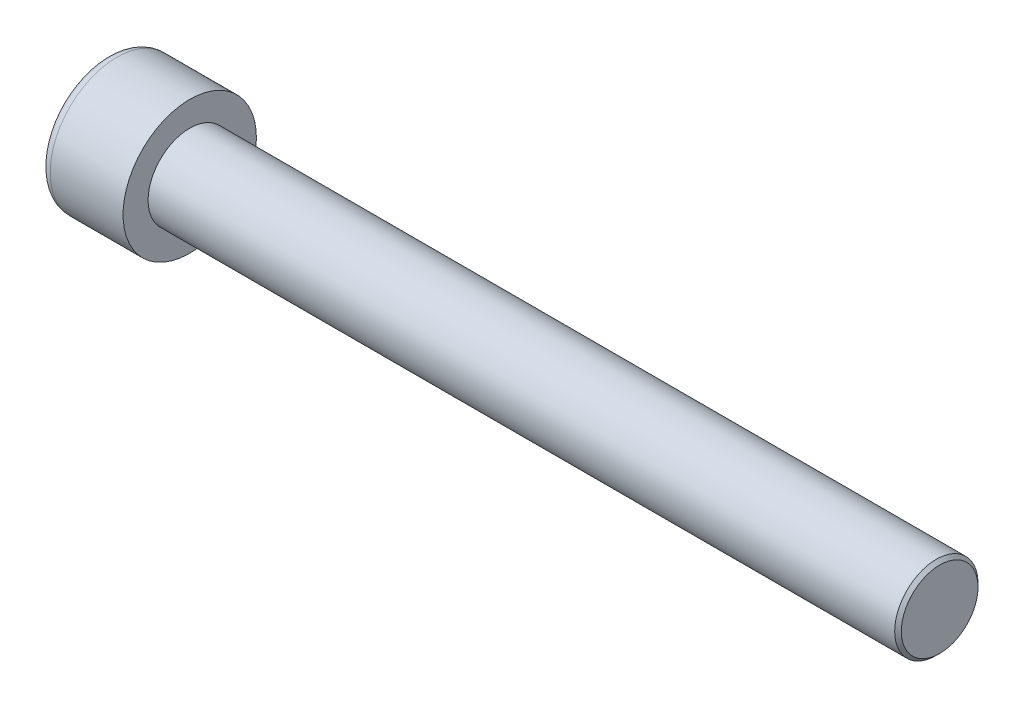
ISO-10303-21;
HEADER;
FILE_DESCRIPTION(('STEP AP214'),'2;1');
FILE_NAME('part.step','',(''),(''),'','','');
FILE_SCHEMA(('AUTOMOTIVE_DESIGN { 1 0 10303 214 1 1 1 1 }'));
ENDSEC;
DATA;
#1=APPLICATION_CONTEXT('core data for automotive mechanical design processes');
#2=APPLICATION_PROTOCOL_DEFINITION('international standard','automotive_design',2000,#1);
#3=PRODUCT_CONTEXT('',#1,'mechanical');
#4=PRODUCT('Part','Part','',(#3));
#5=PRODUCT_RELATED_PRODUCT_CATEGORY('part','',(#4));
#6=PRODUCT_DEFINITION_FORMATION('','',#4);
#7=PRODUCT_DEFINITION_CONTEXT('part definition',#1,'design');
#8=PRODUCT_DEFINITION('design','',#6,#7);
#9=PRODUCT_DEFINITION_SHAPE('','',#8);
#10=(LENGTH_UNIT() NAMED_UNIT(*) SI_UNIT(.MILLI.,.METRE.));
#11=(NAMED_UNIT(*) PLANE_ANGLE_UNIT() SI_UNIT($,.RADIAN.));
#12=(NAMED_UNIT(*) SI_UNIT($,.STERADIAN.) SOLID_ANGLE_UNIT());
#13=UNCERTAINTY_MEASURE_WITH_UNIT(LENGTH_MEASURE(1.E-05),#10,'distance_accuracy_value','');
#14=(GEOMETRIC_REPRESENTATION_CONTEXT(3) GLOBAL_UNCERTAINTY_ASSIGNED_CONTEXT((#13)) GLOBAL_UNIT_ASSIGNED_CONTEXT((#10,
#11,#12)) REPRESENTATION_CONTEXT('',''));
#15=CARTESIAN_POINT('',(0.,0.,0.));
#16=DIRECTION('',(0.,0.,1.));
#17=DIRECTION('',(1.,0.,0.));
#18=AXIS2_PLACEMENT_3D('',#15,#16,#17);
#19=CARTESIAN_POINT('',(5.,0.,-4.61880215351701));
#20=DIRECTION('',(1.,0.,0.));
#21=DIRECTION('',(0.,0.,-1.));
#22=AXIS2_PLACEMENT_3D('',#19,#20,#21);
#23=PLANE('',#22);
#24=CARTESIAN_POINT('',(5.,0.,0.));
#25=DIRECTION('',(1.,0.,0.));
#26=DIRECTION('',(0.,0.,-1.));
#27=AXIS2_PLACEMENT_3D('',#24,#25,#26);
#28=CIRCLE('',#27,4.);
#29=CARTESIAN_POINT('',(5.,-2.,-3.46410161513775));
#30=VERTEX_POINT('',#29);
#31=CARTESIAN_POINT('',(5.,-4.,0.));
#32=VERTEX_POINT('',#31);
#33=EDGE_CURVE('E162',#30,#32,#28,.F.);
#34=ORIENTED_EDGE('',*,*,#33,.F.);
#35=DIRECTION('',(0.,0.866025403784438,-0.5));
#36=VECTOR('',#35,1.);
#37=CARTESIAN_POINT('',(5.,-4.,-2.3094010767585));
#38=LINE('',#37,#36);
#39=CARTESIAN_POINT('',(5.,-4.,-2.3094010767585));
#40=VERTEX_POINT('',#39);
#41=EDGE_CURVE('E170',#40,#30,#38,.T.);
#42=ORIENTED_EDGE('',*,*,#41,.F.);
#43=DIRECTION('',(0.,0.,-1.));
#44=VECTOR('',#43,1.);
#45=CARTESIAN_POINT('',(5.,-4.,2.3094010767585));
#46=LINE('',#45,#44);
#47=EDGE_CURVE('E187',#32,#40,#46,.T.);
#48=ORIENTED_EDGE('',*,*,#47,.F.);
#49=EDGE_LOOP('',(#34,#42,#48));
#50=FACE_BOUND('',#49,.T.);
#51=ADVANCED_FACE('F39',(#50),#23,.F.);
#52=CARTESIAN_POINT('',(5.,-2.,3.46410161513775));
#53=VERTEX_POINT('',#52);
#54=EDGE_CURVE('E292',#32,#53,#28,.F.);
#55=ORIENTED_EDGE('',*,*,#54,.F.);
#56=CARTESIAN_POINT('',(5.,-4.,2.3094010767585));
#57=VERTEX_POINT('',#56);
#58=EDGE_CURVE('E188',#57,#32,#46,.T.);
#59=ORIENTED_EDGE('',*,*,#58,.F.);
#60=DIRECTION('',(0.,-0.866025403784438,-0.5));
#61=VECTOR('',#60,1.);
#62=CARTESIAN_POINT('',(5.,0.,4.61880215351701));
#63=LINE('',#62,#61);
#64=EDGE_CURVE('E183',#53,#57,#63,.T.);
#65=ORIENTED_EDGE('',*,*,#64,.F.);
#66=EDGE_LOOP('',(#55,#59,#65));
#67=FACE_BOUND('',#66,.T.);
#68=ADVANCED_FACE('F128',(#67),#23,.F.);
#69=CARTESIAN_POINT('',(5.,2.,3.46410161513775));
#70=VERTEX_POINT('',#69);
#71=EDGE_CURVE('E288',#53,#70,#28,.F.);
#72=ORIENTED_EDGE('',*,*,#71,.F.);
#73=CARTESIAN_POINT('',(5.,0.,4.61880215351701));
#74=VERTEX_POINT('',#73);
#75=EDGE_CURVE('E184',#74,#53,#63,.T.);
#76=ORIENTED_EDGE('',*,*,#75,.F.);
#77=DIRECTION('',(0.,-0.866025403784439,0.5));
#78=VECTOR('',#77,1.);
#79=CARTESIAN_POINT('',(5.,4.,2.3094010767585));
#80=LINE('',#79,#78);
#81=EDGE_CURVE('E179',#70,#74,#80,.T.);
#82=ORIENTED_EDGE('',*,*,#81,.F.);
#83=EDGE_LOOP('',(#72,#76,#82));
#84=FACE_BOUND('',#83,.T.);
#85=ADVANCED_FACE('F134',(#84),#23,.F.);
#86=CARTESIAN_POINT('',(5.,4.,0.));
#87=VERTEX_POINT('',#86);
#88=EDGE_CURVE('E159',#70,#87,#28,.F.);
#89=ORIENTED_EDGE('',*,*,#88,.F.);
#90=CARTESIAN_POINT('',(5.,4.,2.3094010767585));
#91=VERTEX_POINT('',#90);
#92=EDGE_CURVE('E180',#91,#70,#80,.T.);
#93=ORIENTED_EDGE('',*,*,#92,.F.);
#94=DIRECTION('',(0.,0.,1.));
#95=VECTOR('',#94,1.);
#96=CARTESIAN_POINT('',(5.,4.,-2.3094010767585));
#97=LINE('',#96,#95);
#98=EDGE_CURVE('E174',#87,#91,#97,.T.);
#99=ORIENTED_EDGE('',*,*,#98,.F.);
#100=EDGE_LOOP('',(#89,#93,#99));
#101=FACE_BOUND('',#100,.T.);
#102=ADVANCED_FACE('F148',(#101),#23,.F.);
#103=CARTESIAN_POINT('',(5.,0.,0.));
#104=DIRECTION('',(1.,0.,0.));
#105=DIRECTION('',(0.,0.,-1.));
#106=AXIS2_PLACEMENT_3D('',#103,#104,#105);
#107=CIRCLE('',#106,4.);
#108=CARTESIAN_POINT('',(5.,2.,-3.46410161513775));
#109=VERTEX_POINT('',#108);
#110=EDGE_CURVE('E54',#109,#87,#107,.T.);
#111=ORIENTED_EDGE('',*,*,#110,.T.);
#112=CARTESIAN_POINT('',(5.,4.,-2.3094010767585));
#113=VERTEX_POINT('',#112);
#114=EDGE_CURVE('E167',#113,#87,#97,.T.);
#115=ORIENTED_EDGE('',*,*,#114,.F.);
#116=DIRECTION('',(0.,0.866025403784438,0.5));
#117=VECTOR('',#116,1.);
#118=CARTESIAN_POINT('',(5.,0.,-4.61880215351701));
#119=LINE('',#118,#117);
#120=EDGE_CURVE('E164',#109,#113,#119,.T.);
#121=ORIENTED_EDGE('',*,*,#120,.F.);
#122=EDGE_LOOP('',(#111,#115,#121));
#123=FACE_BOUND('',#122,.T.);
#124=ADVANCED_FACE('F139',(#123),#23,.F.);
#125=EDGE_CURVE('E152',#109,#30,#28,.F.);
#126=ORIENTED_EDGE('',*,*,#125,.F.);
#127=CARTESIAN_POINT('',(5.,0.,-4.61880215351701));
#128=VERTEX_POINT('',#127);
#129=EDGE_CURVE('E155',#128,#109,#119,.T.);
#130=ORIENTED_EDGE('',*,*,#129,.F.);
#131=EDGE_CURVE('E157',#30,#128,#38,.T.);
#132=ORIENTED_EDGE('',*,*,#131,.F.);
#133=EDGE_LOOP('',(#126,#130,#132));
#134=FACE_BOUND('',#133,.T.);
#135=ADVANCED_FACE('F130',(#134),#23,.F.);
#136=CARTESIAN_POINT('',(0.,0.,0.));
#137=DIRECTION('',(1.,0.,0.));
#138=DIRECTION('',(0.,0.,-1.));
#139=AXIS2_PLACEMENT_3D('',#136,#137,#138);
#140=PLANE('',#139);
#141=CARTESIAN_POINT('',(0.,0.,0.));
#142=DIRECTION('',(1.,0.,0.));
#143=DIRECTION('',(0.,0.,-1.));
#144=AXIS2_PLACEMENT_3D('',#141,#142,#143);
#145=CIRCLE('',#144,6.75);
#146=CARTESIAN_POINT('',(0.,0.,-6.75));
#147=VERTEX_POINT('',#146);
#148=EDGE_CURVE('E227',#147,#147,#145,.F.);
#149=ORIENTED_EDGE('',*,*,#148,.T.);
#150=EDGE_LOOP('',(#149));
#151=FACE_BOUND('',#150,.T.);
#152=DIRECTION('',(0.,0.866025403784438,-0.5));
#153=VECTOR('',#152,1.);
#154=CARTESIAN_POINT('',(0.,-4.,-2.3094010767585));
#155=LINE('',#154,#153);
#156=CARTESIAN_POINT('',(0.,-4.,-2.3094010767585));
#157=VERTEX_POINT('',#156);
#158=CARTESIAN_POINT('',(0.,0.,-4.61880215351701));
#159=VERTEX_POINT('',#158);
#160=EDGE_CURVE('E62',#157,#159,#155,.T.);
#161=ORIENTED_EDGE('',*,*,#160,.T.);
#162=DIRECTION('',(0.,0.866025403784438,0.5));
#163=VECTOR('',#162,1.);
#164=CARTESIAN_POINT('',(0.,0.,-4.61880215351701));
#165=LINE('',#164,#163);
#166=CARTESIAN_POINT('',(0.,4.,-2.3094010767585));
#167=VERTEX_POINT('',#166);
#168=EDGE_CURVE('E193',#159,#167,#165,.T.);
#169=ORIENTED_EDGE('',*,*,#168,.T.);
#170=DIRECTION('',(0.,0.,1.));
#171=VECTOR('',#170,1.);
#172=CARTESIAN_POINT('',(0.,4.,-2.3094010767585));
#173=LINE('',#172,#171);
#174=CARTESIAN_POINT('',(0.,4.,2.3094010767585));
#175=VERTEX_POINT('',#174);
#176=EDGE_CURVE('E196',#167,#175,#173,.T.);
#177=ORIENTED_EDGE('',*,*,#176,.T.);
#178=DIRECTION('',(0.,-0.866025403784439,0.5));
#179=VECTOR('',#178,1.);
#180=CARTESIAN_POINT('',(0.,4.,2.3094010767585));
#181=LINE('',#180,#179);
#182=CARTESIAN_POINT('',(0.,0.,4.61880215351701));
#183=VERTEX_POINT('',#182);
#184=EDGE_CURVE('E199',#175,#183,#181,.T.);
#185=ORIENTED_EDGE('',*,*,#184,.T.);
#186=DIRECTION('',(0.,-0.866025403784438,-0.5));
#187=VECTOR('',#186,1.);
#188=CARTESIAN_POINT('',(0.,0.,4.61880215351701));
#189=LINE('',#188,#187);
#190=CARTESIAN_POINT('',(0.,-4.,2.3094010767585));
#191=VERTEX_POINT('',#190);
#192=EDGE_CURVE('E202',#183,#191,#189,.T.);
#193=ORIENTED_EDGE('',*,*,#192,.T.);
#194=DIRECTION('',(0.,0.,-1.));
#195=VECTOR('',#194,1.);
#196=CARTESIAN_POINT('',(0.,-4.,2.3094010767585));
#197=LINE('',#196,#195);
#198=EDGE_CURVE('E205',#191,#157,#197,.T.);
#199=ORIENTED_EDGE('',*,*,#198,.T.);
#200=EDGE_LOOP('',(#161,#169,#177,#185,#193,#199));
#201=FACE_BOUND('',#200,.T.);
#202=ADVANCED_FACE('F138',(#151,#201),#140,.F.);
#203=CARTESIAN_POINT('',(10.,0.,0.));
#204=DIRECTION('',(1.,0.,0.));
#205=DIRECTION('',(0.,0.,-1.));
#206=AXIS2_PLACEMENT_3D('',#203,#204,#205);
#207=PLANE('',#206);
#208=CARTESIAN_POINT('',(10.,0.,0.));
#209=DIRECTION('',(1.,0.,0.));
#210=DIRECTION('',(0.,0.,-1.));
#211=AXIS2_PLACEMENT_3D('',#208,#209,#210);
#212=CIRCLE('',#211,8.);
#213=CARTESIAN_POINT('',(10.,0.,-8.));
#214=VERTEX_POINT('',#213);
#215=EDGE_CURVE('E160',#214,#214,#212,.T.);
#216=ORIENTED_EDGE('',*,*,#215,.T.);
#217=EDGE_LOOP('',(#216));
#218=FACE_BOUND('',#217,.T.);
#219=CARTESIAN_POINT('',(10.,0.,0.));
#220=DIRECTION('',(1.,0.,0.));
#221=DIRECTION('',(0.,0.,-1.));
#222=AXIS2_PLACEMENT_3D('',#219,#220,#221);
#223=CIRCLE('',#222,5.);
#224=CARTESIAN_POINT('',(10.,0.,5.));
#225=VERTEX_POINT('',#224);
#226=EDGE_CURVE('E218',#225,#225,#223,.T.);
#227=ORIENTED_EDGE('',*,*,#226,.F.);
#228=EDGE_LOOP('',(#227));
#229=FACE_BOUND('',#228,.T.);
#230=ADVANCED_FACE('F145',(#218,#229),#207,.T.);
#231=CARTESIAN_POINT('',(10.,0.,0.));
#232=DIRECTION('',(-1.,0.,0.));
#233=DIRECTION('',(0.,0.,1.));
#234=AXIS2_PLACEMENT_3D('',#231,#232,#233);
#235=CYLINDRICAL_SURFACE('',#234,8.);
#236=CARTESIAN_POINT('',(1.25,0.,0.));
#237=DIRECTION('',(1.,0.,0.));
#238=DIRECTION('',(0.,0.,-1.));
#239=AXIS2_PLACEMENT_3D('',#236,#237,#238);
#240=CIRCLE('',#239,8.);
#241=CARTESIAN_POINT('',(1.25,0.,-8.));
#242=VERTEX_POINT('',#241);
#243=EDGE_CURVE('E224',#242,#242,#240,.T.);
#244=ORIENTED_EDGE('',*,*,#243,.T.);
#245=EDGE_LOOP('',(#244));
#246=FACE_BOUND('',#245,.T.);
#247=ORIENTED_EDGE('',*,*,#215,.F.);
#248=EDGE_LOOP('',(#247));
#249=FACE_BOUND('',#248,.T.);
#250=ADVANCED_FACE('F243',(#246,#249),#235,.T.);
#251=CARTESIAN_POINT('',(100.,0.,0.));
#252=DIRECTION('',(-1.,0.,0.));
#253=DIRECTION('',(0.,0.,1.));
#254=AXIS2_PLACEMENT_3D('',#251,#252,#253);
#255=CYLINDRICAL_SURFACE('',#254,5.);
#256=CARTESIAN_POINT('',(99.6,0.,0.));
#257=DIRECTION('',(1.,0.,0.));
#258=DIRECTION('',(0.,0.,-1.));
#259=AXIS2_PLACEMENT_3D('',#256,#257,#258);
#260=CIRCLE('',#259,5.);
#261=CARTESIAN_POINT('',(99.6,0.,5.));
#262=VERTEX_POINT('',#261);
#263=EDGE_CURVE('E11',#262,#262,#260,.F.);
#264=CARTESIAN_POINT('',(99.6,0.,5.));
#265=CARTESIAN_POINT('',(98.6666666666667,0.,5.));
#266=CARTESIAN_POINT('',(97.7333333333333,0.,5.));
#267=CARTESIAN_POINT('',(95.8666666666667,0.,5.));
#268=CARTESIAN_POINT('',(94.9333333333333,0.,5.));
#269=CARTESIAN_POINT('',(93.0666666666667,0.,5.));
#270=CARTESIAN_POINT('',(92.1333333333333,0.,5.));
#271=CARTESIAN_POINT('',(90.2666666666667,0.,5.));
#272=CARTESIAN_POINT('',(89.3333333333333,0.,5.));
#273=CARTESIAN_POINT('',(87.4666666666667,0.,5.));
#274=CARTESIAN_POINT('',(86.5333333333333,0.,5.));
#275=CARTESIAN_POINT('',(84.6666666666667,0.,5.));
#276=CARTESIAN_POINT('',(83.7333333333333,0.,5.));
#277=CARTESIAN_POINT('',(81.8666666666667,0.,5.));
#278=CARTESIAN_POINT('',(80.9333333333333,0.,5.));
#279=CARTESIAN_POINT('',(79.0666666666667,0.,5.));
#280=CARTESIAN_POINT('',(78.1333333333333,0.,5.));
#281=CARTESIAN_POINT('',(76.2666666666667,0.,5.));
#282=CARTESIAN_POINT('',(75.3333333333333,0.,5.));
#283=CARTESIAN_POINT('',(73.4666666666667,0.,5.));
#284=CARTESIAN_POINT('',(72.5333333333333,0.,5.));
#285=CARTESIAN_POINT('',(70.6666666666667,0.,5.));
#286=CARTESIAN_POINT('',(69.7333333333333,0.,5.));
#287=CARTESIAN_POINT('',(67.8666666666667,0.,5.));
#288=CARTESIAN_POINT('',(66.9333333333334,0.,5.));
#289=CARTESIAN_POINT('',(65.0666666666667,0.,5.));
#290=CARTESIAN_POINT('',(64.1333333333334,0.,5.));
#291=CARTESIAN_POINT('',(62.2666666666667,0.,5.));
#292=CARTESIAN_POINT('',(61.3333333333333,0.,5.));
#293=CARTESIAN_POINT('',(59.4666666666667,0.,5.));
#294=CARTESIAN_POINT('',(58.5333333333333,0.,5.));
#295=CARTESIAN_POINT('',(56.6666666666667,0.,5.));
#296=CARTESIAN_POINT('',(55.7333333333333,0.,5.));
#297=CARTESIAN_POINT('',(53.8666666666667,0.,5.));
#298=CARTESIAN_POINT('',(52.9333333333334,0.,5.));
#299=CARTESIAN_POINT('',(51.0666666666667,0.,5.));
#300=CARTESIAN_POINT('',(50.1333333333333,0.,5.));
#301=CARTESIAN_POINT('',(48.2666666666667,0.,5.));
#302=CARTESIAN_POINT('',(47.3333333333333,0.,5.));
#303=CARTESIAN_POINT('',(45.4666666666667,0.,5.));
#304=CARTESIAN_POINT('',(44.5333333333333,0.,5.));
#305=CARTESIAN_POINT('',(42.6666666666667,0.,5.));
#306=CARTESIAN_POINT('',(41.7333333333333,0.,5.));
#307=CARTESIAN_POINT('',(39.8666666666667,0.,5.));
#308=CARTESIAN_POINT('',(38.9333333333333,0.,5.));
#309=CARTESIAN_POINT('',(37.0666666666667,0.,5.));
#310=CARTESIAN_POINT('',(36.1333333333333,0.,5.));
#311=CARTESIAN_POINT('',(34.2666666666667,0.,5.));
#312=CARTESIAN_POINT('',(33.3333333333333,0.,5.));
#313=CARTESIAN_POINT('',(31.4666666666667,0.,5.));
#314=CARTESIAN_POINT('',(30.5333333333333,0.,5.));
#315=CARTESIAN_POINT('',(28.6666666666667,0.,5.));
#316=CARTESIAN_POINT('',(27.7333333333333,0.,5.));
#317=CARTESIAN_POINT('',(25.8666666666667,0.,5.));
#318=CARTESIAN_POINT('',(24.9333333333333,0.,5.));
#319=CARTESIAN_POINT('',(23.0666666666667,0.,5.));
#320=CARTESIAN_POINT('',(22.1333333333333,0.,5.));
#321=CARTESIAN_POINT('',(20.2666666666667,0.,5.));
#322=CARTESIAN_POINT('',(19.3333333333333,0.,5.));
#323=CARTESIAN_POINT('',(17.4666666666667,0.,5.));
#324=CARTESIAN_POINT('',(16.5333333333333,0.,5.));
#325=CARTESIAN_POINT('',(14.6666666666667,0.,5.));
#326=CARTESIAN_POINT('',(13.7333333333333,0.,5.));
#327=CARTESIAN_POINT('',(11.8666666666667,0.,5.));
#328=CARTESIAN_POINT('',(10.9333333333333,0.,5.));
#329=CARTESIAN_POINT('',(10.,0.,5.));
#330=B_SPLINE_CURVE_WITH_KNOTS('',3,(#264,#265,#266,#267,#268,#269,#270,#271,#272,#273,#274,
#275,#276,#277,#278,#279,#280,#281,#282,#283,#284,#285,#286,#287,#288,#289,#290,#291,#292,#293,
#294,#295,#296,#297,#298,#299,#300,#301,#302,#303,#304,#305,#306,#307,#308,#309,#310,#311,#312,
#313,#314,#315,#316,#317,#318,#319,#320,#321,#322,#323,#324,#325,#326,#327,#328,#329),
.UNSPECIFIED.,.F.,.F.,(4,2,2,2,2,2,2,2,2,2,2,2,2,2,2,2,2,2,2,2,2,2,2,2,2,2,2,2,2,2,2,2,4),(0.,
2.8,5.59999999999999,8.39999999999999,11.2,14.,16.8,19.6,22.4,25.2,28.,30.8,33.6,36.4,39.2,42.,
44.8,47.6,50.4,53.2,56.,58.8,61.6,64.4,67.2,70.,72.8,75.6,78.4,81.2,84.,86.8,89.6),.UNSPECIFIED.);
#331=EDGE_CURVE('BSEAM240',#262,#225,#330,.T.);
#332=ORIENTED_EDGE('',*,*,#263,.T.);
#333=ORIENTED_EDGE('',*,*,#226,.T.);
#334=ORIENTED_EDGE('',*,*,#331,.T.);
#335=ORIENTED_EDGE('',*,*,#331,.F.);
#336=EDGE_LOOP('',(#332,#334,#333,#335));
#337=FACE_BOUND('',#336,.T.);
#338=ADVANCED_FACE('F240',(#337),#255,.T.);
#339=CARTESIAN_POINT('',(100.,0.,0.));
#340=DIRECTION('',(1.,0.,0.));
#341=DIRECTION('',(0.,0.,-1.));
#342=AXIS2_PLACEMENT_3D('',#339,#340,#341);
#343=PLANE('',#342);
#344=CARTESIAN_POINT('',(100.,0.,0.));
#345=DIRECTION('',(1.,0.,0.));
#346=DIRECTION('',(0.,0.,-1.));
#347=AXIS2_PLACEMENT_3D('',#344,#345,#346);
#348=CIRCLE('',#347,4.60000000000005);
#349=CARTESIAN_POINT('',(100.,0.,-4.60000000000005));
#350=VERTEX_POINT('',#349);
#351=EDGE_CURVE('E47',#350,#350,#348,.T.);
#352=ORIENTED_EDGE('',*,*,#351,.T.);
#353=EDGE_LOOP('',(#352));
#354=FACE_BOUND('',#353,.T.);
#355=ADVANCED_FACE('F232',(#354),#343,.T.);
#356=CARTESIAN_POINT('',(5.,-4.,-2.3094010767585));
#357=DIRECTION('',(0.,0.5,0.866025403784439));
#358=DIRECTION('',(0.,-0.866025403784439,0.5));
#359=AXIS2_PLACEMENT_3D('',#356,#357,#358);
#360=PLANE('',#359);
#361=ORIENTED_EDGE('',*,*,#160,.F.);
#362=DIRECTION('',(-1.,0.,0.));
#363=VECTOR('',#362,1.);
#364=CARTESIAN_POINT('',(5.,-4.,-2.3094010767585));
#365=LINE('',#364,#363);
#366=EDGE_CURVE('E191',#40,#157,#365,.T.);
#367=ORIENTED_EDGE('',*,*,#366,.F.);
#368=ORIENTED_EDGE('',*,*,#41,.T.);
#369=ORIENTED_EDGE('',*,*,#131,.T.);
#370=DIRECTION('',(-1.,0.,0.));
#371=VECTOR('',#370,1.);
#372=CARTESIAN_POINT('',(5.,0.,-4.61880215351701));
#373=LINE('',#372,#371);
#374=EDGE_CURVE('E173',#128,#159,#373,.T.);
#375=ORIENTED_EDGE('',*,*,#374,.T.);
#376=EDGE_LOOP('',(#361,#367,#368,#369,#375));
#377=FACE_BOUND('',#376,.T.);
#378=ADVANCED_FACE('F258',(#377),#360,.T.);
#379=CARTESIAN_POINT('',(5.,0.,-4.61880215351701));
#380=DIRECTION('',(0.,-0.5,0.866025403784438));
#381=DIRECTION('',(0.,-0.866025403784438,-0.5));
#382=AXIS2_PLACEMENT_3D('',#379,#380,#381);
#383=PLANE('',#382);
#384=ORIENTED_EDGE('',*,*,#168,.F.);
#385=ORIENTED_EDGE('',*,*,#374,.F.);
#386=ORIENTED_EDGE('',*,*,#129,.T.);
#387=ORIENTED_EDGE('',*,*,#120,.T.);
#388=DIRECTION('',(-1.,0.,0.));
#389=VECTOR('',#388,1.);
#390=CARTESIAN_POINT('',(5.,4.,-2.3094010767585));
#391=LINE('',#390,#389);
#392=EDGE_CURVE('E215',#113,#167,#391,.T.);
#393=ORIENTED_EDGE('',*,*,#392,.T.);
#394=EDGE_LOOP('',(#384,#385,#386,#387,#393));
#395=FACE_BOUND('',#394,.T.);
#396=ADVANCED_FACE('F172',(#395),#383,.T.);
#397=CARTESIAN_POINT('',(5.,4.,-2.3094010767585));
#398=DIRECTION('',(0.,-1.,0.));
#399=DIRECTION('',(0.,0.,-1.));
#400=AXIS2_PLACEMENT_3D('',#397,#398,#399);
#401=PLANE('',#400);
#402=ORIENTED_EDGE('',*,*,#176,.F.);
#403=ORIENTED_EDGE('',*,*,#392,.F.);
#404=ORIENTED_EDGE('',*,*,#114,.T.);
#405=ORIENTED_EDGE('',*,*,#98,.T.);
#406=DIRECTION('',(-1.,0.,0.));
#407=VECTOR('',#406,1.);
#408=CARTESIAN_POINT('',(5.,4.,2.3094010767585));
#409=LINE('',#408,#407);
#410=EDGE_CURVE('E213',#91,#175,#409,.T.);
#411=ORIENTED_EDGE('',*,*,#410,.T.);
#412=EDGE_LOOP('',(#402,#403,#404,#405,#411));
#413=FACE_BOUND('',#412,.T.);
#414=ADVANCED_FACE('F263',(#413),#401,.T.);
#415=CARTESIAN_POINT('',(5.,4.,2.3094010767585));
#416=DIRECTION('',(0.,-0.5,-0.866025403784439));
#417=DIRECTION('',(0.,0.866025403784439,-0.5));
#418=AXIS2_PLACEMENT_3D('',#415,#416,#417);
#419=PLANE('',#418);
#420=ORIENTED_EDGE('',*,*,#184,.F.);
#421=ORIENTED_EDGE('',*,*,#410,.F.);
#422=ORIENTED_EDGE('',*,*,#92,.T.);
#423=ORIENTED_EDGE('',*,*,#81,.T.);
#424=DIRECTION('',(-1.,0.,0.));
#425=VECTOR('',#424,1.);
#426=CARTESIAN_POINT('',(5.,0.,4.61880215351701));
#427=LINE('',#426,#425);
#428=EDGE_CURVE('E211',#74,#183,#427,.T.);
#429=ORIENTED_EDGE('',*,*,#428,.T.);
#430=EDGE_LOOP('',(#420,#421,#422,#423,#429));
#431=FACE_BOUND('',#430,.T.);
#432=ADVANCED_FACE('F266',(#431),#419,.T.);
#433=CARTESIAN_POINT('',(5.,0.,4.61880215351701));
#434=DIRECTION('',(0.,0.5,-0.866025403784438));
#435=DIRECTION('',(0.,0.866025403784438,0.5));
#436=AXIS2_PLACEMENT_3D('',#433,#434,#435);
#437=PLANE('',#436);
#438=ORIENTED_EDGE('',*,*,#192,.F.);
#439=ORIENTED_EDGE('',*,*,#428,.F.);
#440=ORIENTED_EDGE('',*,*,#75,.T.);
#441=ORIENTED_EDGE('',*,*,#64,.T.);
#442=DIRECTION('',(-1.,0.,0.));
#443=VECTOR('',#442,1.);
#444=CARTESIAN_POINT('',(5.,-4.,2.3094010767585));
#445=LINE('',#444,#443);
#446=EDGE_CURVE('E209',#57,#191,#445,.T.);
#447=ORIENTED_EDGE('',*,*,#446,.T.);
#448=EDGE_LOOP('',(#438,#439,#440,#441,#447));
#449=FACE_BOUND('',#448,.T.);
#450=ADVANCED_FACE('F123',(#449),#437,.T.);
#451=CARTESIAN_POINT('',(5.,-4.,2.3094010767585));
#452=DIRECTION('',(0.,1.,0.));
#453=DIRECTION('',(0.,0.,1.));
#454=AXIS2_PLACEMENT_3D('',#451,#452,#453);
#455=PLANE('',#454);
#456=ORIENTED_EDGE('',*,*,#198,.F.);
#457=ORIENTED_EDGE('',*,*,#446,.F.);
#458=ORIENTED_EDGE('',*,*,#58,.T.);
#459=ORIENTED_EDGE('',*,*,#47,.T.);
#460=ORIENTED_EDGE('',*,*,#366,.T.);
#461=EDGE_LOOP('',(#456,#457,#458,#459,#460));
#462=FACE_BOUND('',#461,.T.);
#463=ADVANCED_FACE('F116',(#462),#455,.T.);
#464=CARTESIAN_POINT('',(5.,0.,0.));
#465=DIRECTION('',(-1.,0.,0.));
#466=DIRECTION('',(0.,0.,1.));
#467=AXIS2_PLACEMENT_3D('',#464,#465,#466);
#468=CONICAL_SURFACE('',#467,4.,1.04719755119659);
#469=CARTESIAN_POINT('',(7.30940107675853,0.,0.));
#470=VERTEX_POINT('',#469);
#471=VERTEX_LOOP('',#470);
#472=FACE_BOUND('',#471,.T.);
#473=ORIENTED_EDGE('',*,*,#110,.F.);
#474=ORIENTED_EDGE('',*,*,#125,.T.);
#475=ORIENTED_EDGE('',*,*,#33,.T.);
#476=ORIENTED_EDGE('',*,*,#54,.T.);
#477=ORIENTED_EDGE('',*,*,#71,.T.);
#478=ORIENTED_EDGE('',*,*,#88,.T.);
#479=EDGE_LOOP('',(#473,#474,#475,#476,#477,#478));
#480=FACE_BOUND('',#479,.T.);
#481=ADVANCED_FACE('F113',(#472,#480),#468,.F.);
#482=CARTESIAN_POINT('',(1.25,0.,0.));
#483=DIRECTION('',(1.,0.,0.));
#484=DIRECTION('',(0.,0.,-1.));
#485=AXIS2_PLACEMENT_3D('',#482,#483,#484);
#486=TOROIDAL_SURFACE('',#485,6.75,1.25);
#487=ORIENTED_EDGE('',*,*,#148,.F.);
#488=EDGE_LOOP('',(#487));
#489=FACE_BOUND('',#488,.T.);
#490=ORIENTED_EDGE('',*,*,#243,.F.);
#491=EDGE_LOOP('',(#490));
#492=FACE_BOUND('',#491,.T.);
#493=ADVANCED_FACE('F115',(#489,#492),#486,.T.);
#494=CARTESIAN_POINT('',(100.,0.,0.));
#495=DIRECTION('',(-1.,0.,0.));
#496=DIRECTION('',(0.,0.,1.));
#497=AXIS2_PLACEMENT_3D('',#494,#495,#496);
#498=CONICAL_SURFACE('',#497,4.60000000000005,0.785398163397427);
#499=ORIENTED_EDGE('',*,*,#263,.F.);
#500=EDGE_LOOP('',(#499));
#501=FACE_BOUND('',#500,.T.);
#502=ORIENTED_EDGE('',*,*,#351,.F.);
#503=EDGE_LOOP('',(#502));
#504=FACE_BOUND('',#503,.T.);
#505=ADVANCED_FACE('F41',(#501,#504),#498,.T.);
#506=CLOSED_SHELL('',(#51,#68,#85,#102,#124,#135,#202,#230,#250,#338,#355,#378,#396,#414,#432,
#450,#463,#481,#493,#505));
#507=MANIFOLD_SOLID_BREP('B2',#506);
#508=ADVANCED_BREP_SHAPE_REPRESENTATION('',(#18,#507),#14);
#509=SHAPE_DEFINITION_REPRESENTATION(#9,#508);
ENDSEC;
END-ISO-10303-21;
